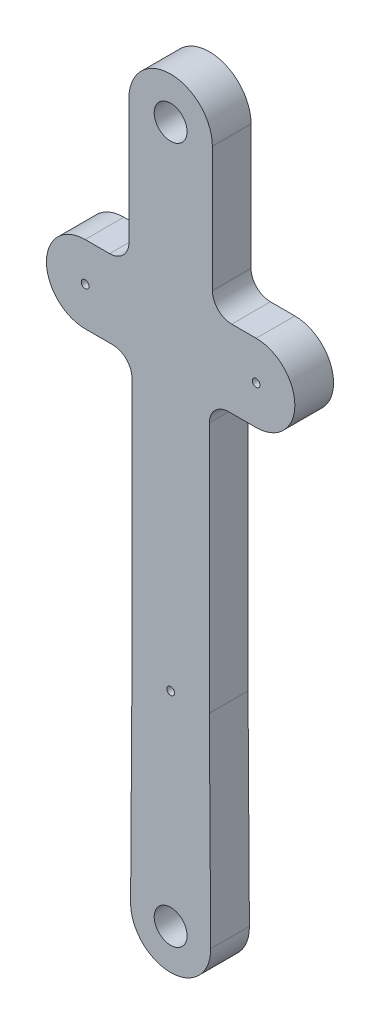
ISO-10303-21;
HEADER;
FILE_DESCRIPTION(('STEP AP214'),'2;1');
FILE_NAME('part.step','',(''),(''),'','','');
FILE_SCHEMA(('AUTOMOTIVE_DESIGN { 1 0 10303 214 1 1 1 1 }'));
ENDSEC;
DATA;
#1=APPLICATION_CONTEXT('core data for automotive mechanical design processes');
#2=APPLICATION_PROTOCOL_DEFINITION('international standard','automotive_design',2000,#1);
#3=PRODUCT_CONTEXT('',#1,'mechanical');
#4=PRODUCT('Part','Part','',(#3));
#5=PRODUCT_RELATED_PRODUCT_CATEGORY('part','',(#4));
#6=PRODUCT_DEFINITION_FORMATION('','',#4);
#7=PRODUCT_DEFINITION_CONTEXT('part definition',#1,'design');
#8=PRODUCT_DEFINITION('design','',#6,#7);
#9=PRODUCT_DEFINITION_SHAPE('','',#8);
#10=(LENGTH_UNIT() NAMED_UNIT(*) SI_UNIT(.MILLI.,.METRE.));
#11=(NAMED_UNIT(*) PLANE_ANGLE_UNIT() SI_UNIT($,.RADIAN.));
#12=(NAMED_UNIT(*) SI_UNIT($,.STERADIAN.) SOLID_ANGLE_UNIT());
#13=UNCERTAINTY_MEASURE_WITH_UNIT(LENGTH_MEASURE(1.E-05),#10,'distance_accuracy_value','');
#14=(GEOMETRIC_REPRESENTATION_CONTEXT(3) GLOBAL_UNCERTAINTY_ASSIGNED_CONTEXT((#13)) GLOBAL_UNIT_ASSIGNED_CONTEXT((#10,
#11,#12)) REPRESENTATION_CONTEXT('',''));
#15=CARTESIAN_POINT('',(0.,0.,0.));
#16=DIRECTION('',(0.,0.,1.));
#17=DIRECTION('',(1.,0.,0.));
#18=AXIS2_PLACEMENT_3D('',#15,#16,#17);
#19=CARTESIAN_POINT('',(-22.1,0.,10.));
#20=DIRECTION('',(0.,0.,1.));
#21=DIRECTION('',(1.,0.,0.));
#22=AXIS2_PLACEMENT_3D('',#19,#20,#21);
#23=PLANE('',#22);
#24=CARTESIAN_POINT('',(0.,47.3122607378935,10.));
#25=DIRECTION('',(0.,0.,1.));
#26=DIRECTION('',(1.,0.,0.));
#27=AXIS2_PLACEMENT_3D('',#24,#25,#26);
#28=CIRCLE('',#27,4.25);
#29=CARTESIAN_POINT('',(4.25,47.3122607378935,10.));
#30=VERTEX_POINT('',#29);
#31=EDGE_CURVE('E340',#30,#30,#28,.T.);
#32=ORIENTED_EDGE('',*,*,#31,.F.);
#33=EDGE_LOOP('',(#32));
#34=FACE_BOUND('',#33,.T.);
#35=CARTESIAN_POINT('',(22.1,0.,10.));
#36=DIRECTION('',(0.,0.,1.));
#37=DIRECTION('',(1.,0.,0.));
#38=AXIS2_PLACEMENT_3D('',#35,#36,#37);
#39=CIRCLE('',#38,1.);
#40=CARTESIAN_POINT('',(23.1,0.,10.));
#41=VERTEX_POINT('',#40);
#42=EDGE_CURVE('E328',#41,#41,#39,.T.);
#43=ORIENTED_EDGE('',*,*,#42,.F.);
#44=EDGE_LOOP('',(#43));
#45=FACE_BOUND('',#44,.T.);
#46=CARTESIAN_POINT('',(-22.1,0.,10.));
#47=DIRECTION('',(0.,0.,1.));
#48=DIRECTION('',(1.,0.,0.));
#49=AXIS2_PLACEMENT_3D('',#46,#47,#48);
#50=CIRCLE('',#49,10.);
#51=CARTESIAN_POINT('',(-22.1,10.,10.));
#52=VERTEX_POINT('',#51);
#53=CARTESIAN_POINT('',(-22.1,-10.,10.));
#54=VERTEX_POINT('',#53);
#55=EDGE_CURVE('E170',#52,#54,#50,.T.);
#56=ORIENTED_EDGE('',*,*,#55,.T.);
#57=DIRECTION('',(1.,0.,0.));
#58=VECTOR('',#57,1.);
#59=CARTESIAN_POINT('',(-22.1,-10.,10.));
#60=LINE('',#59,#58);
#61=CARTESIAN_POINT('',(-15.,-10.,10.));
#62=VERTEX_POINT('',#61);
#63=EDGE_CURVE('E158',#54,#62,#60,.T.);
#64=ORIENTED_EDGE('',*,*,#63,.T.);
#65=CARTESIAN_POINT('',(-15.,-15.,10.));
#66=DIRECTION('',(0.,0.,1.));
#67=DIRECTION('',(1.,0.,0.));
#68=AXIS2_PLACEMENT_3D('',#65,#66,#67);
#69=CIRCLE('',#68,5.);
#70=CARTESIAN_POINT('',(-9.99999999999999,-15.,10.));
#71=VERTEX_POINT('',#70);
#72=EDGE_CURVE('E215',#62,#71,#69,.F.);
#73=ORIENTED_EDGE('',*,*,#72,.T.);
#74=DIRECTION('',(0.,-1.,0.));
#75=VECTOR('',#74,1.);
#76=CARTESIAN_POINT('',(-9.99999999999999,-80.,10.));
#77=LINE('',#76,#75);
#78=CARTESIAN_POINT('',(-9.99999999999999,-80.,10.));
#79=VERTEX_POINT('',#78);
#80=EDGE_CURVE('E169',#71,#79,#77,.T.);
#81=ORIENTED_EDGE('',*,*,#80,.T.);
#82=DIRECTION('',(-0.00671697923275562,-0.999977440840535,0.));
#83=VECTOR('',#82,1.);
#84=CARTESIAN_POINT('',(-10.3528567364597,-132.530872000857,10.));
#85=LINE('',#84,#83);
#86=CARTESIAN_POINT('',(-10.3528567364597,-132.530872000857,10.));
#87=VERTEX_POINT('',#86);
#88=EDGE_CURVE('E322',#79,#87,#85,.T.);
#89=ORIENTED_EDGE('',*,*,#88,.T.);
#90=CARTESIAN_POINT('',(0.,-132.687739262107,10.));
#91=DIRECTION('',(0.,0.,1.));
#92=DIRECTION('',(1.,0.,0.));
#93=AXIS2_PLACEMENT_3D('',#90,#91,#92);
#94=CIRCLE('',#93,10.3540451005059);
#95=CARTESIAN_POINT('',(10.3528567364597,-132.530872000857,10.));
#96=VERTEX_POINT('',#95);
#97=EDGE_CURVE('E293',#87,#96,#94,.T.);
#98=ORIENTED_EDGE('',*,*,#97,.T.);
#99=DIRECTION('',(-0.00671697923275601,0.999977440840535,0.));
#100=VECTOR('',#99,1.);
#101=CARTESIAN_POINT('',(10.3528567364597,-132.530872000857,10.));
#102=LINE('',#101,#100);
#103=CARTESIAN_POINT('',(9.99999999999999,-80.,10.));
#104=VERTEX_POINT('',#103);
#105=EDGE_CURVE('E319',#96,#104,#102,.T.);
#106=ORIENTED_EDGE('',*,*,#105,.T.);
#107=DIRECTION('',(0.,1.,0.));
#108=VECTOR('',#107,1.);
#109=CARTESIAN_POINT('',(9.99999999999999,-80.,10.));
#110=LINE('',#109,#108);
#111=CARTESIAN_POINT('',(9.99999999999999,-15.,10.));
#112=VERTEX_POINT('',#111);
#113=EDGE_CURVE('E226',#104,#112,#110,.T.);
#114=ORIENTED_EDGE('',*,*,#113,.T.);
#115=CARTESIAN_POINT('',(15.,-15.,10.));
#116=DIRECTION('',(0.,0.,1.));
#117=DIRECTION('',(1.,0.,0.));
#118=AXIS2_PLACEMENT_3D('',#115,#116,#117);
#119=CIRCLE('',#118,5.);
#120=CARTESIAN_POINT('',(15.,-10.,10.));
#121=VERTEX_POINT('',#120);
#122=EDGE_CURVE('E219',#112,#121,#119,.F.);
#123=ORIENTED_EDGE('',*,*,#122,.T.);
#124=DIRECTION('',(1.,0.,0.));
#125=VECTOR('',#124,1.);
#126=CARTESIAN_POINT('',(9.99999999999999,-10.,10.));
#127=LINE('',#126,#125);
#128=CARTESIAN_POINT('',(22.1,-10.,10.));
#129=VERTEX_POINT('',#128);
#130=EDGE_CURVE('E223',#121,#129,#127,.T.);
#131=ORIENTED_EDGE('',*,*,#130,.T.);
#132=CARTESIAN_POINT('',(22.1,0.,10.));
#133=DIRECTION('',(0.,0.,1.));
#134=DIRECTION('',(1.,0.,0.));
#135=AXIS2_PLACEMENT_3D('',#132,#133,#134);
#136=CIRCLE('',#135,10.);
#137=CARTESIAN_POINT('',(22.1,10.,10.));
#138=VERTEX_POINT('',#137);
#139=EDGE_CURVE('E236',#129,#138,#136,.T.);
#140=ORIENTED_EDGE('',*,*,#139,.T.);
#141=DIRECTION('',(-1.,0.,0.));
#142=VECTOR('',#141,1.);
#143=CARTESIAN_POINT('',(10.7828841411512,10.,10.));
#144=LINE('',#143,#142);
#145=CARTESIAN_POINT('',(15.7828841411512,10.,10.));
#146=VERTEX_POINT('',#145);
#147=EDGE_CURVE('E315',#138,#146,#144,.T.);
#148=ORIENTED_EDGE('',*,*,#147,.T.);
#149=CARTESIAN_POINT('',(15.7828841411512,15.,10.));
#150=DIRECTION('',(0.,0.,1.));
#151=DIRECTION('',(1.,0.,0.));
#152=AXIS2_PLACEMENT_3D('',#149,#150,#151);
#153=CIRCLE('',#152,5.);
#154=CARTESIAN_POINT('',(10.7828841411512,15.,10.));
#155=VERTEX_POINT('',#154);
#156=EDGE_CURVE('E11',#146,#155,#153,.F.);
#157=ORIENTED_EDGE('',*,*,#156,.T.);
#158=DIRECTION('',(0.,1.,0.));
#159=VECTOR('',#158,1.);
#160=CARTESIAN_POINT('',(10.7828841411512,47.3122607378935,10.));
#161=LINE('',#160,#159);
#162=CARTESIAN_POINT('',(10.7828841411512,47.3122607378935,10.));
#163=VERTEX_POINT('',#162);
#164=EDGE_CURVE('E313',#155,#163,#161,.T.);
#165=ORIENTED_EDGE('',*,*,#164,.T.);
#166=CARTESIAN_POINT('',(0.,47.3122607378935,10.));
#167=DIRECTION('',(0.,0.,1.));
#168=DIRECTION('',(1.,0.,0.));
#169=AXIS2_PLACEMENT_3D('',#166,#167,#168);
#170=CIRCLE('',#169,10.7828841411512);
#171=CARTESIAN_POINT('',(-10.7828841411512,47.3122607378935,10.));
#172=VERTEX_POINT('',#171);
#173=EDGE_CURVE('E311',#163,#172,#170,.T.);
#174=ORIENTED_EDGE('',*,*,#173,.T.);
#175=DIRECTION('',(0.,-1.,0.));
#176=VECTOR('',#175,1.);
#177=CARTESIAN_POINT('',(-10.7828841411512,47.3122607378935,10.));
#178=LINE('',#177,#176);
#179=CARTESIAN_POINT('',(-10.7828841411512,15.,10.));
#180=VERTEX_POINT('',#179);
#181=EDGE_CURVE('E308',#172,#180,#178,.T.);
#182=ORIENTED_EDGE('',*,*,#181,.T.);
#183=CARTESIAN_POINT('',(-15.7828841411512,15.,10.));
#184=DIRECTION('',(0.,0.,1.));
#185=DIRECTION('',(1.,0.,0.));
#186=AXIS2_PLACEMENT_3D('',#183,#184,#185);
#187=CIRCLE('',#186,5.);
#188=CARTESIAN_POINT('',(-15.7828841411512,10.,10.));
#189=VERTEX_POINT('',#188);
#190=EDGE_CURVE('E211',#180,#189,#187,.F.);
#191=ORIENTED_EDGE('',*,*,#190,.T.);
#192=DIRECTION('',(-1.,0.,0.));
#193=VECTOR('',#192,1.);
#194=CARTESIAN_POINT('',(-22.1,10.,10.));
#195=LINE('',#194,#193);
#196=EDGE_CURVE('E175',#189,#52,#195,.T.);
#197=ORIENTED_EDGE('',*,*,#196,.T.);
#198=EDGE_LOOP('',(#56,#64,#73,#81,#89,#98,#106,#114,#123,#131,#140,#148,#157,#165,#174,#182,
#191,#197));
#199=FACE_BOUND('',#198,.T.);
#200=CARTESIAN_POINT('',(-22.1,0.,10.));
#201=DIRECTION('',(0.,0.,1.));
#202=DIRECTION('',(1.,0.,0.));
#203=AXIS2_PLACEMENT_3D('',#200,#201,#202);
#204=CIRCLE('',#203,1.);
#205=CARTESIAN_POINT('',(-21.1,0.,10.));
#206=VERTEX_POINT('',#205);
#207=EDGE_CURVE('E306',#206,#206,#204,.T.);
#208=ORIENTED_EDGE('',*,*,#207,.F.);
#209=EDGE_LOOP('',(#208));
#210=FACE_BOUND('',#209,.T.);
#211=CARTESIAN_POINT('',(0.,-80.,10.));
#212=DIRECTION('',(0.,0.,1.));
#213=DIRECTION('',(1.,0.,0.));
#214=AXIS2_PLACEMENT_3D('',#211,#212,#213);
#215=CIRCLE('',#214,1.);
#216=CARTESIAN_POINT('',(1.00000000000001,-80.,10.));
#217=VERTEX_POINT('',#216);
#218=EDGE_CURVE('E334',#217,#217,#215,.T.);
#219=ORIENTED_EDGE('',*,*,#218,.F.);
#220=EDGE_LOOP('',(#219));
#221=FACE_BOUND('',#220,.T.);
#222=CARTESIAN_POINT('',(0.,-132.687739262107,10.));
#223=DIRECTION('',(0.,0.,1.));
#224=DIRECTION('',(1.,0.,0.));
#225=AXIS2_PLACEMENT_3D('',#222,#223,#224);
#226=CIRCLE('',#225,4.25);
#227=CARTESIAN_POINT('',(4.25000000000001,-132.687739262107,10.));
#228=VERTEX_POINT('',#227);
#229=EDGE_CURVE('E346',#228,#228,#226,.T.);
#230=ORIENTED_EDGE('',*,*,#229,.F.);
#231=EDGE_LOOP('',(#230));
#232=FACE_BOUND('',#231,.T.);
#233=ADVANCED_FACE('F33',(#34,#45,#199,#210,#221,#232),#23,.T.);
#234=CARTESIAN_POINT('',(-22.1,0.,0.));
#235=DIRECTION('',(0.,0.,1.));
#236=DIRECTION('',(1.,0.,0.));
#237=AXIS2_PLACEMENT_3D('',#234,#235,#236);
#238=PLANE('',#237);
#239=CARTESIAN_POINT('',(-22.1,0.,0.));
#240=DIRECTION('',(0.,0.,1.));
#241=DIRECTION('',(1.,0.,0.));
#242=AXIS2_PLACEMENT_3D('',#239,#240,#241);
#243=CIRCLE('',#242,10.);
#244=CARTESIAN_POINT('',(-22.1,10.,0.));
#245=VERTEX_POINT('',#244);
#246=CARTESIAN_POINT('',(-22.1,-10.,0.));
#247=VERTEX_POINT('',#246);
#248=EDGE_CURVE('E183',#245,#247,#243,.T.);
#249=ORIENTED_EDGE('',*,*,#248,.F.);
#250=DIRECTION('',(-1.,0.,0.));
#251=VECTOR('',#250,1.);
#252=CARTESIAN_POINT('',(-22.1,10.,0.));
#253=LINE('',#252,#251);
#254=CARTESIAN_POINT('',(-15.7828841411512,10.,0.));
#255=VERTEX_POINT('',#254);
#256=EDGE_CURVE('E179',#255,#245,#253,.T.);
#257=ORIENTED_EDGE('',*,*,#256,.F.);
#258=CARTESIAN_POINT('',(-15.7828841411512,15.,0.));
#259=DIRECTION('',(0.,0.,1.));
#260=DIRECTION('',(1.,0.,0.));
#261=AXIS2_PLACEMENT_3D('',#258,#259,#260);
#262=CIRCLE('',#261,5.);
#263=CARTESIAN_POINT('',(-10.7828841411512,15.,0.));
#264=VERTEX_POINT('',#263);
#265=EDGE_CURVE('E209',#255,#264,#262,.T.);
#266=ORIENTED_EDGE('',*,*,#265,.T.);
#267=DIRECTION('',(0.,-1.,0.));
#268=VECTOR('',#267,1.);
#269=CARTESIAN_POINT('',(-10.7828841411512,47.3122607378935,0.));
#270=LINE('',#269,#268);
#271=CARTESIAN_POINT('',(-10.7828841411512,47.3122607378935,0.));
#272=VERTEX_POINT('',#271);
#273=EDGE_CURVE('E267',#272,#264,#270,.T.);
#274=ORIENTED_EDGE('',*,*,#273,.F.);
#275=CARTESIAN_POINT('',(0.,47.3122607378935,0.));
#276=DIRECTION('',(0.,0.,1.));
#277=DIRECTION('',(1.,0.,0.));
#278=AXIS2_PLACEMENT_3D('',#275,#276,#277);
#279=CIRCLE('',#278,10.7828841411512);
#280=CARTESIAN_POINT('',(10.7828841411512,47.3122607378935,0.));
#281=VERTEX_POINT('',#280);
#282=EDGE_CURVE('E265',#281,#272,#279,.T.);
#283=ORIENTED_EDGE('',*,*,#282,.F.);
#284=DIRECTION('',(0.,1.,0.));
#285=VECTOR('',#284,1.);
#286=CARTESIAN_POINT('',(10.7828841411512,47.3122607378935,0.));
#287=LINE('',#286,#285);
#288=CARTESIAN_POINT('',(10.7828841411512,15.,0.));
#289=VERTEX_POINT('',#288);
#290=EDGE_CURVE('E263',#289,#281,#287,.T.);
#291=ORIENTED_EDGE('',*,*,#290,.F.);
#292=CARTESIAN_POINT('',(15.7828841411512,15.,0.));
#293=DIRECTION('',(0.,0.,1.));
#294=DIRECTION('',(1.,0.,0.));
#295=AXIS2_PLACEMENT_3D('',#292,#293,#294);
#296=CIRCLE('',#295,5.);
#297=CARTESIAN_POINT('',(15.7828841411512,10.,0.));
#298=VERTEX_POINT('',#297);
#299=EDGE_CURVE('E41',#289,#298,#296,.T.);
#300=ORIENTED_EDGE('',*,*,#299,.T.);
#301=DIRECTION('',(-1.,0.,0.));
#302=VECTOR('',#301,1.);
#303=CARTESIAN_POINT('',(10.7828841411512,10.,0.));
#304=LINE('',#303,#302);
#305=CARTESIAN_POINT('',(22.1,10.,0.));
#306=VERTEX_POINT('',#305);
#307=EDGE_CURVE('E261',#306,#298,#304,.T.);
#308=ORIENTED_EDGE('',*,*,#307,.F.);
#309=CARTESIAN_POINT('',(22.1,0.,0.));
#310=DIRECTION('',(0.,0.,1.));
#311=DIRECTION('',(1.,0.,0.));
#312=AXIS2_PLACEMENT_3D('',#309,#310,#311);
#313=CIRCLE('',#312,10.);
#314=CARTESIAN_POINT('',(22.1,-10.,0.));
#315=VERTEX_POINT('',#314);
#316=EDGE_CURVE('E254',#315,#306,#313,.T.);
#317=ORIENTED_EDGE('',*,*,#316,.F.);
#318=DIRECTION('',(1.,0.,0.));
#319=VECTOR('',#318,1.);
#320=CARTESIAN_POINT('',(9.99999999999999,-10.,0.));
#321=LINE('',#320,#319);
#322=CARTESIAN_POINT('',(15.,-10.,0.));
#323=VERTEX_POINT('',#322);
#324=EDGE_CURVE('E246',#323,#315,#321,.T.);
#325=ORIENTED_EDGE('',*,*,#324,.F.);
#326=CARTESIAN_POINT('',(15.,-15.,0.));
#327=DIRECTION('',(0.,0.,1.));
#328=DIRECTION('',(1.,0.,0.));
#329=AXIS2_PLACEMENT_3D('',#326,#327,#328);
#330=CIRCLE('',#329,5.);
#331=CARTESIAN_POINT('',(9.99999999999999,-15.,0.));
#332=VERTEX_POINT('',#331);
#333=EDGE_CURVE('E217',#323,#332,#330,.T.);
#334=ORIENTED_EDGE('',*,*,#333,.T.);
#335=DIRECTION('',(0.,1.,0.));
#336=VECTOR('',#335,1.);
#337=CARTESIAN_POINT('',(9.99999999999999,-80.,0.));
#338=LINE('',#337,#336);
#339=CARTESIAN_POINT('',(9.99999999999999,-80.,0.));
#340=VERTEX_POINT('',#339);
#341=EDGE_CURVE('E244',#340,#332,#338,.T.);
#342=ORIENTED_EDGE('',*,*,#341,.F.);
#343=DIRECTION('',(-0.00671697923275601,0.999977440840535,0.));
#344=VECTOR('',#343,1.);
#345=CARTESIAN_POINT('',(10.3528567364597,-132.530872000857,0.));
#346=LINE('',#345,#344);
#347=CARTESIAN_POINT('',(10.3528567364597,-132.530872000857,0.));
#348=VERTEX_POINT('',#347);
#349=EDGE_CURVE('E252',#348,#340,#346,.T.);
#350=ORIENTED_EDGE('',*,*,#349,.F.);
#351=CARTESIAN_POINT('',(0.,-132.687739262107,0.));
#352=DIRECTION('',(0.,0.,1.));
#353=DIRECTION('',(1.,0.,0.));
#354=AXIS2_PLACEMENT_3D('',#351,#352,#353);
#355=CIRCLE('',#354,10.3540451005059);
#356=CARTESIAN_POINT('',(-10.3528567364597,-132.530872000857,0.));
#357=VERTEX_POINT('',#356);
#358=EDGE_CURVE('E256',#357,#348,#355,.T.);
#359=ORIENTED_EDGE('',*,*,#358,.F.);
#360=DIRECTION('',(-0.00671697923275562,-0.999977440840535,0.));
#361=VECTOR('',#360,1.);
#362=CARTESIAN_POINT('',(-10.3528567364597,-132.530872000857,0.));
#363=LINE('',#362,#361);
#364=CARTESIAN_POINT('',(-9.99999999999999,-80.,0.));
#365=VERTEX_POINT('',#364);
#366=EDGE_CURVE('E298',#365,#357,#363,.T.);
#367=ORIENTED_EDGE('',*,*,#366,.F.);
#368=DIRECTION('',(0.,-1.,0.));
#369=VECTOR('',#368,1.);
#370=CARTESIAN_POINT('',(-9.99999999999999,-80.,0.));
#371=LINE('',#370,#369);
#372=CARTESIAN_POINT('',(-9.99999999999999,-15.,0.));
#373=VERTEX_POINT('',#372);
#374=EDGE_CURVE('E299',#373,#365,#371,.T.);
#375=ORIENTED_EDGE('',*,*,#374,.F.);
#376=CARTESIAN_POINT('',(-15.,-15.,0.));
#377=DIRECTION('',(0.,0.,1.));
#378=DIRECTION('',(1.,0.,0.));
#379=AXIS2_PLACEMENT_3D('',#376,#377,#378);
#380=CIRCLE('',#379,5.);
#381=CARTESIAN_POINT('',(-15.,-10.,0.));
#382=VERTEX_POINT('',#381);
#383=EDGE_CURVE('E213',#373,#382,#380,.T.);
#384=ORIENTED_EDGE('',*,*,#383,.T.);
#385=DIRECTION('',(1.,0.,0.));
#386=VECTOR('',#385,1.);
#387=CARTESIAN_POINT('',(-22.1,-10.,0.));
#388=LINE('',#387,#386);
#389=EDGE_CURVE('E303',#247,#382,#388,.T.);
#390=ORIENTED_EDGE('',*,*,#389,.F.);
#391=EDGE_LOOP('',(#249,#257,#266,#274,#283,#291,#300,#308,#317,#325,#334,#342,#350,#359,#367,
#375,#384,#390));
#392=FACE_BOUND('',#391,.T.);
#393=CARTESIAN_POINT('',(-22.1,0.,0.));
#394=DIRECTION('',(0.,0.,1.));
#395=DIRECTION('',(1.,0.,0.));
#396=AXIS2_PLACEMENT_3D('',#393,#394,#395);
#397=CIRCLE('',#396,1.);
#398=CARTESIAN_POINT('',(-21.1,0.,0.));
#399=VERTEX_POINT('',#398);
#400=EDGE_CURVE('E325',#399,#399,#397,.T.);
#401=ORIENTED_EDGE('',*,*,#400,.T.);
#402=EDGE_LOOP('',(#401));
#403=FACE_BOUND('',#402,.T.);
#404=CARTESIAN_POINT('',(22.1,0.,0.));
#405=DIRECTION('',(0.,0.,1.));
#406=DIRECTION('',(1.,0.,0.));
#407=AXIS2_PLACEMENT_3D('',#404,#405,#406);
#408=CIRCLE('',#407,1.);
#409=CARTESIAN_POINT('',(23.1,0.,0.));
#410=VERTEX_POINT('',#409);
#411=EDGE_CURVE('E331',#410,#410,#408,.T.);
#412=ORIENTED_EDGE('',*,*,#411,.T.);
#413=EDGE_LOOP('',(#412));
#414=FACE_BOUND('',#413,.T.);
#415=CARTESIAN_POINT('',(0.,-80.,0.));
#416=DIRECTION('',(0.,0.,1.));
#417=DIRECTION('',(1.,0.,0.));
#418=AXIS2_PLACEMENT_3D('',#415,#416,#417);
#419=CIRCLE('',#418,1.);
#420=CARTESIAN_POINT('',(1.00000000000001,-80.,0.));
#421=VERTEX_POINT('',#420);
#422=EDGE_CURVE('E337',#421,#421,#419,.T.);
#423=ORIENTED_EDGE('',*,*,#422,.T.);
#424=EDGE_LOOP('',(#423));
#425=FACE_BOUND('',#424,.T.);
#426=CARTESIAN_POINT('',(0.,47.3122607378935,0.));
#427=DIRECTION('',(0.,0.,1.));
#428=DIRECTION('',(1.,0.,0.));
#429=AXIS2_PLACEMENT_3D('',#426,#427,#428);
#430=CIRCLE('',#429,4.25);
#431=CARTESIAN_POINT('',(4.25,47.3122607378935,0.));
#432=VERTEX_POINT('',#431);
#433=EDGE_CURVE('E343',#432,#432,#430,.T.);
#434=ORIENTED_EDGE('',*,*,#433,.T.);
#435=EDGE_LOOP('',(#434));
#436=FACE_BOUND('',#435,.T.);
#437=CARTESIAN_POINT('',(0.,-132.687739262107,0.));
#438=DIRECTION('',(0.,0.,1.));
#439=DIRECTION('',(1.,0.,0.));
#440=AXIS2_PLACEMENT_3D('',#437,#438,#439);
#441=CIRCLE('',#440,4.25);
#442=CARTESIAN_POINT('',(4.25000000000001,-132.687739262107,0.));
#443=VERTEX_POINT('',#442);
#444=EDGE_CURVE('E349',#443,#443,#441,.T.);
#445=ORIENTED_EDGE('',*,*,#444,.T.);
#446=EDGE_LOOP('',(#445));
#447=FACE_BOUND('',#446,.T.);
#448=ADVANCED_FACE('F241',(#392,#403,#414,#425,#436,#447),#238,.F.);
#449=CARTESIAN_POINT('',(-22.1,0.,10.));
#450=DIRECTION('',(0.,0.,-1.));
#451=DIRECTION('',(-1.,0.,0.));
#452=AXIS2_PLACEMENT_3D('',#449,#450,#451);
#453=CYLINDRICAL_SURFACE('',#452,10.);
#454=ORIENTED_EDGE('',*,*,#248,.T.);
#455=DIRECTION('',(0.,0.,-1.));
#456=VECTOR('',#455,1.);
#457=CARTESIAN_POINT('',(-22.1,-10.,10.));
#458=LINE('',#457,#456);
#459=EDGE_CURVE('E163',#54,#247,#458,.T.);
#460=ORIENTED_EDGE('',*,*,#459,.F.);
#461=ORIENTED_EDGE('',*,*,#55,.F.);
#462=DIRECTION('',(0.,0.,-1.));
#463=VECTOR('',#462,1.);
#464=CARTESIAN_POINT('',(-22.1,10.,10.));
#465=LINE('',#464,#463);
#466=EDGE_CURVE('E271',#52,#245,#465,.T.);
#467=ORIENTED_EDGE('',*,*,#466,.T.);
#468=EDGE_LOOP('',(#454,#460,#461,#467));
#469=FACE_BOUND('',#468,.T.);
#470=ADVANCED_FACE('F181',(#469),#453,.T.);
#471=CARTESIAN_POINT('',(-22.1,-10.,10.));
#472=DIRECTION('',(0.,1.,0.));
#473=DIRECTION('',(0.,0.,1.));
#474=AXIS2_PLACEMENT_3D('',#471,#472,#473);
#475=PLANE('',#474);
#476=ORIENTED_EDGE('',*,*,#389,.T.);
#477=DIRECTION('',(0.,0.,-1.));
#478=VECTOR('',#477,1.);
#479=CARTESIAN_POINT('',(-15.,-10.,10.));
#480=LINE('',#479,#478);
#481=EDGE_CURVE('E166',#382,#62,#480,.F.);
#482=ORIENTED_EDGE('',*,*,#481,.T.);
#483=ORIENTED_EDGE('',*,*,#63,.F.);
#484=ORIENTED_EDGE('',*,*,#459,.T.);
#485=EDGE_LOOP('',(#476,#482,#483,#484));
#486=FACE_BOUND('',#485,.T.);
#487=ADVANCED_FACE('F161',(#486),#475,.F.);
#488=CARTESIAN_POINT('',(-9.99999999999999,-80.,10.));
#489=DIRECTION('',(1.,0.,0.));
#490=DIRECTION('',(0.,0.,-1.));
#491=AXIS2_PLACEMENT_3D('',#488,#489,#490);
#492=PLANE('',#491);
#493=ORIENTED_EDGE('',*,*,#80,.F.);
#494=DIRECTION('',(0.,0.,-1.));
#495=VECTOR('',#494,1.);
#496=CARTESIAN_POINT('',(-9.99999999999999,-15.,0.));
#497=LINE('',#496,#495);
#498=EDGE_CURVE('E196',#71,#373,#497,.T.);
#499=ORIENTED_EDGE('',*,*,#498,.T.);
#500=ORIENTED_EDGE('',*,*,#374,.T.);
#501=DIRECTION('',(0.,0.,-1.));
#502=VECTOR('',#501,1.);
#503=CARTESIAN_POINT('',(-9.99999999999999,-80.,10.));
#504=LINE('',#503,#502);
#505=EDGE_CURVE('E185',#79,#365,#504,.T.);
#506=ORIENTED_EDGE('',*,*,#505,.F.);
#507=EDGE_LOOP('',(#493,#499,#500,#506));
#508=FACE_BOUND('',#507,.T.);
#509=ADVANCED_FACE('F407',(#508),#492,.F.);
#510=CARTESIAN_POINT('',(-10.3528567364597,-132.530872000857,10.));
#511=DIRECTION('',(0.999977440840536,-0.00671697923275562,0.));
#512=DIRECTION('',(0.00671697923275562,0.999977440840536,0.));
#513=AXIS2_PLACEMENT_3D('',#510,#511,#512);
#514=PLANE('',#513);
#515=ORIENTED_EDGE('',*,*,#366,.T.);
#516=DIRECTION('',(0.,0.,-1.));
#517=VECTOR('',#516,1.);
#518=CARTESIAN_POINT('',(-10.3528567364597,-132.530872000857,10.));
#519=LINE('',#518,#517);
#520=EDGE_CURVE('E191',#87,#357,#519,.T.);
#521=ORIENTED_EDGE('',*,*,#520,.F.);
#522=ORIENTED_EDGE('',*,*,#88,.F.);
#523=ORIENTED_EDGE('',*,*,#505,.T.);
#524=EDGE_LOOP('',(#515,#521,#522,#523));
#525=FACE_BOUND('',#524,.T.);
#526=ADVANCED_FACE('F404',(#525),#514,.F.);
#527=CARTESIAN_POINT('',(0.,-132.687739262107,10.));
#528=DIRECTION('',(0.,0.,-1.));
#529=DIRECTION('',(-1.,0.,0.));
#530=AXIS2_PLACEMENT_3D('',#527,#528,#529);
#531=CYLINDRICAL_SURFACE('',#530,10.3540451005059);
#532=ORIENTED_EDGE('',*,*,#358,.T.);
#533=DIRECTION('',(0.,0.,-1.));
#534=VECTOR('',#533,1.);
#535=CARTESIAN_POINT('',(10.3528567364597,-132.530872000857,10.));
#536=LINE('',#535,#534);
#537=EDGE_CURVE('E284',#96,#348,#536,.T.);
#538=ORIENTED_EDGE('',*,*,#537,.F.);
#539=ORIENTED_EDGE('',*,*,#97,.F.);
#540=ORIENTED_EDGE('',*,*,#520,.T.);
#541=EDGE_LOOP('',(#532,#538,#539,#540));
#542=FACE_BOUND('',#541,.T.);
#543=ADVANCED_FACE('F291',(#542),#531,.T.);
#544=CARTESIAN_POINT('',(10.3528567364597,-132.530872000857,10.));
#545=DIRECTION('',(-0.999977440840536,-0.00671697923275601,0.));
#546=DIRECTION('',(0.00671697923275601,-0.999977440840536,0.));
#547=AXIS2_PLACEMENT_3D('',#544,#545,#546);
#548=PLANE('',#547);
#549=ORIENTED_EDGE('',*,*,#349,.T.);
#550=DIRECTION('',(0.,0.,-1.));
#551=VECTOR('',#550,1.);
#552=CARTESIAN_POINT('',(9.99999999999999,-80.,10.));
#553=LINE('',#552,#551);
#554=EDGE_CURVE('E251',#104,#340,#553,.T.);
#555=ORIENTED_EDGE('',*,*,#554,.F.);
#556=ORIENTED_EDGE('',*,*,#105,.F.);
#557=ORIENTED_EDGE('',*,*,#537,.T.);
#558=EDGE_LOOP('',(#549,#555,#556,#557));
#559=FACE_BOUND('',#558,.T.);
#560=ADVANCED_FACE('F398',(#559),#548,.F.);
#561=CARTESIAN_POINT('',(9.99999999999999,-80.,10.));
#562=DIRECTION('',(-1.,0.,0.));
#563=DIRECTION('',(0.,-1.,0.));
#564=AXIS2_PLACEMENT_3D('',#561,#562,#563);
#565=PLANE('',#564);
#566=ORIENTED_EDGE('',*,*,#341,.T.);
#567=DIRECTION('',(0.,0.,-1.));
#568=VECTOR('',#567,1.);
#569=CARTESIAN_POINT('',(9.99999999999999,-15.,10.));
#570=LINE('',#569,#568);
#571=EDGE_CURVE('E203',#332,#112,#570,.F.);
#572=ORIENTED_EDGE('',*,*,#571,.T.);
#573=ORIENTED_EDGE('',*,*,#113,.F.);
#574=ORIENTED_EDGE('',*,*,#554,.T.);
#575=EDGE_LOOP('',(#566,#572,#573,#574));
#576=FACE_BOUND('',#575,.T.);
#577=ADVANCED_FACE('F249',(#576),#565,.F.);
#578=CARTESIAN_POINT('',(9.99999999999999,-10.,10.));
#579=DIRECTION('',(0.,1.,0.));
#580=DIRECTION('',(0.,0.,1.));
#581=AXIS2_PLACEMENT_3D('',#578,#579,#580);
#582=PLANE('',#581);
#583=ORIENTED_EDGE('',*,*,#130,.F.);
#584=DIRECTION('',(0.,0.,-1.));
#585=VECTOR('',#584,1.);
#586=CARTESIAN_POINT('',(15.,-10.,0.));
#587=LINE('',#586,#585);
#588=EDGE_CURVE('E200',#121,#323,#587,.T.);
#589=ORIENTED_EDGE('',*,*,#588,.T.);
#590=ORIENTED_EDGE('',*,*,#324,.T.);
#591=DIRECTION('',(0.,0.,-1.));
#592=VECTOR('',#591,1.);
#593=CARTESIAN_POINT('',(22.1,-10.,10.));
#594=LINE('',#593,#592);
#595=EDGE_CURVE('E234',#129,#315,#594,.T.);
#596=ORIENTED_EDGE('',*,*,#595,.F.);
#597=EDGE_LOOP('',(#583,#589,#590,#596));
#598=FACE_BOUND('',#597,.T.);
#599=ADVANCED_FACE('F231',(#598),#582,.F.);
#600=CARTESIAN_POINT('',(22.1,0.,10.));
#601=DIRECTION('',(0.,0.,-1.));
#602=DIRECTION('',(-1.,0.,0.));
#603=AXIS2_PLACEMENT_3D('',#600,#601,#602);
#604=CYLINDRICAL_SURFACE('',#603,10.);
#605=ORIENTED_EDGE('',*,*,#316,.T.);
#606=DIRECTION('',(0.,0.,-1.));
#607=VECTOR('',#606,1.);
#608=CARTESIAN_POINT('',(22.1,10.,10.));
#609=LINE('',#608,#607);
#610=EDGE_CURVE('E279',#138,#306,#609,.T.);
#611=ORIENTED_EDGE('',*,*,#610,.F.);
#612=ORIENTED_EDGE('',*,*,#139,.F.);
#613=ORIENTED_EDGE('',*,*,#595,.T.);
#614=EDGE_LOOP('',(#605,#611,#612,#613));
#615=FACE_BOUND('',#614,.T.);
#616=ADVANCED_FACE('F390',(#615),#604,.T.);
#617=CARTESIAN_POINT('',(10.7828841411512,10.,10.));
#618=DIRECTION('',(0.,-1.,0.));
#619=DIRECTION('',(1.,0.,0.));
#620=AXIS2_PLACEMENT_3D('',#617,#618,#619);
#621=PLANE('',#620);
#622=ORIENTED_EDGE('',*,*,#307,.T.);
#623=DIRECTION('',(0.,0.,-1.));
#624=VECTOR('',#623,1.);
#625=CARTESIAN_POINT('',(15.7828841411512,10.,10.));
#626=LINE('',#625,#624);
#627=EDGE_CURVE('E48',#298,#146,#626,.F.);
#628=ORIENTED_EDGE('',*,*,#627,.T.);
#629=ORIENTED_EDGE('',*,*,#147,.F.);
#630=ORIENTED_EDGE('',*,*,#610,.T.);
#631=EDGE_LOOP('',(#622,#628,#629,#630));
#632=FACE_BOUND('',#631,.T.);
#633=ADVANCED_FACE('F386',(#632),#621,.F.);
#634=CARTESIAN_POINT('',(10.7828841411512,47.3122607378935,10.));
#635=DIRECTION('',(-1.,0.,0.));
#636=DIRECTION('',(0.,-1.,0.));
#637=AXIS2_PLACEMENT_3D('',#634,#635,#636);
#638=PLANE('',#637);
#639=ORIENTED_EDGE('',*,*,#164,.F.);
#640=DIRECTION('',(0.,0.,-1.));
#641=VECTOR('',#640,1.);
#642=CARTESIAN_POINT('',(10.7828841411512,15.,0.));
#643=LINE('',#642,#641);
#644=EDGE_CURVE('E205',#155,#289,#643,.T.);
#645=ORIENTED_EDGE('',*,*,#644,.T.);
#646=ORIENTED_EDGE('',*,*,#290,.T.);
#647=DIRECTION('',(0.,0.,-1.));
#648=VECTOR('',#647,1.);
#649=CARTESIAN_POINT('',(10.7828841411512,47.3122607378935,10.));
#650=LINE('',#649,#648);
#651=EDGE_CURVE('E276',#163,#281,#650,.T.);
#652=ORIENTED_EDGE('',*,*,#651,.F.);
#653=EDGE_LOOP('',(#639,#645,#646,#652));
#654=FACE_BOUND('',#653,.T.);
#655=ADVANCED_FACE('F382',(#654),#638,.F.);
#656=CARTESIAN_POINT('',(0.,47.3122607378935,10.));
#657=DIRECTION('',(0.,0.,-1.));
#658=DIRECTION('',(-1.,0.,0.));
#659=AXIS2_PLACEMENT_3D('',#656,#657,#658);
#660=CYLINDRICAL_SURFACE('',#659,10.7828841411512);
#661=ORIENTED_EDGE('',*,*,#282,.T.);
#662=DIRECTION('',(0.,0.,-1.));
#663=VECTOR('',#662,1.);
#664=CARTESIAN_POINT('',(-10.7828841411512,47.3122607378935,10.));
#665=LINE('',#664,#663);
#666=EDGE_CURVE('E273',#172,#272,#665,.T.);
#667=ORIENTED_EDGE('',*,*,#666,.F.);
#668=ORIENTED_EDGE('',*,*,#173,.F.);
#669=ORIENTED_EDGE('',*,*,#651,.T.);
#670=EDGE_LOOP('',(#661,#667,#668,#669));
#671=FACE_BOUND('',#670,.T.);
#672=ADVANCED_FACE('F378',(#671),#660,.T.);
#673=CARTESIAN_POINT('',(-10.7828841411512,47.3122607378935,10.));
#674=DIRECTION('',(1.,0.,0.));
#675=DIRECTION('',(0.,0.,-1.));
#676=AXIS2_PLACEMENT_3D('',#673,#674,#675);
#677=PLANE('',#676);
#678=ORIENTED_EDGE('',*,*,#273,.T.);
#679=DIRECTION('',(0.,0.,-1.));
#680=VECTOR('',#679,1.);
#681=CARTESIAN_POINT('',(-10.7828841411512,15.,10.));
#682=LINE('',#681,#680);
#683=EDGE_CURVE('E188',#264,#180,#682,.F.);
#684=ORIENTED_EDGE('',*,*,#683,.T.);
#685=ORIENTED_EDGE('',*,*,#181,.F.);
#686=ORIENTED_EDGE('',*,*,#666,.T.);
#687=EDGE_LOOP('',(#678,#684,#685,#686));
#688=FACE_BOUND('',#687,.T.);
#689=ADVANCED_FACE('F374',(#688),#677,.F.);
#690=CARTESIAN_POINT('',(-22.1,10.,10.));
#691=DIRECTION('',(0.,-1.,0.));
#692=DIRECTION('',(1.,0.,0.));
#693=AXIS2_PLACEMENT_3D('',#690,#691,#692);
#694=PLANE('',#693);
#695=ORIENTED_EDGE('',*,*,#196,.F.);
#696=DIRECTION('',(0.,0.,-1.));
#697=VECTOR('',#696,1.);
#698=CARTESIAN_POINT('',(-15.7828841411512,10.,0.));
#699=LINE('',#698,#697);
#700=EDGE_CURVE('E184',#189,#255,#699,.T.);
#701=ORIENTED_EDGE('',*,*,#700,.T.);
#702=ORIENTED_EDGE('',*,*,#256,.T.);
#703=ORIENTED_EDGE('',*,*,#466,.F.);
#704=EDGE_LOOP('',(#695,#701,#702,#703));
#705=FACE_BOUND('',#704,.T.);
#706=ADVANCED_FACE('F371',(#705),#694,.F.);
#707=CARTESIAN_POINT('',(-22.1,0.,10.));
#708=DIRECTION('',(0.,0.,-1.));
#709=DIRECTION('',(-1.,0.,0.));
#710=AXIS2_PLACEMENT_3D('',#707,#708,#709);
#711=CYLINDRICAL_SURFACE('',#710,1.);
#712=ORIENTED_EDGE('',*,*,#207,.T.);
#713=EDGE_LOOP('',(#712));
#714=FACE_BOUND('',#713,.T.);
#715=ORIENTED_EDGE('',*,*,#400,.F.);
#716=EDGE_LOOP('',(#715));
#717=FACE_BOUND('',#716,.T.);
#718=ADVANCED_FACE('F368',(#714,#717),#711,.F.);
#719=CARTESIAN_POINT('',(22.1,0.,10.));
#720=DIRECTION('',(0.,0.,-1.));
#721=DIRECTION('',(-1.,0.,0.));
#722=AXIS2_PLACEMENT_3D('',#719,#720,#721);
#723=CYLINDRICAL_SURFACE('',#722,1.);
#724=ORIENTED_EDGE('',*,*,#42,.T.);
#725=EDGE_LOOP('',(#724));
#726=FACE_BOUND('',#725,.T.);
#727=ORIENTED_EDGE('',*,*,#411,.F.);
#728=EDGE_LOOP('',(#727));
#729=FACE_BOUND('',#728,.T.);
#730=ADVANCED_FACE('F556',(#726,#729),#723,.F.);
#731=CARTESIAN_POINT('',(0.,-80.,10.));
#732=DIRECTION('',(0.,0.,-1.));
#733=DIRECTION('',(-1.,0.,0.));
#734=AXIS2_PLACEMENT_3D('',#731,#732,#733);
#735=CYLINDRICAL_SURFACE('',#734,1.);
#736=ORIENTED_EDGE('',*,*,#218,.T.);
#737=EDGE_LOOP('',(#736));
#738=FACE_BOUND('',#737,.T.);
#739=ORIENTED_EDGE('',*,*,#422,.F.);
#740=EDGE_LOOP('',(#739));
#741=FACE_BOUND('',#740,.T.);
#742=ADVANCED_FACE('F546',(#738,#741),#735,.F.);
#743=CARTESIAN_POINT('',(0.,47.3122607378935,10.));
#744=DIRECTION('',(0.,0.,-1.));
#745=DIRECTION('',(-1.,0.,0.));
#746=AXIS2_PLACEMENT_3D('',#743,#744,#745);
#747=CYLINDRICAL_SURFACE('',#746,4.25);
#748=ORIENTED_EDGE('',*,*,#31,.T.);
#749=EDGE_LOOP('',(#748));
#750=FACE_BOUND('',#749,.T.);
#751=ORIENTED_EDGE('',*,*,#433,.F.);
#752=EDGE_LOOP('',(#751));
#753=FACE_BOUND('',#752,.T.);
#754=ADVANCED_FACE('F537',(#750,#753),#747,.F.);
#755=CARTESIAN_POINT('',(0.,-132.687739262107,10.));
#756=DIRECTION('',(0.,0.,-1.));
#757=DIRECTION('',(-1.,0.,0.));
#758=AXIS2_PLACEMENT_3D('',#755,#756,#757);
#759=CYLINDRICAL_SURFACE('',#758,4.25);
#760=ORIENTED_EDGE('',*,*,#229,.T.);
#761=EDGE_LOOP('',(#760));
#762=FACE_BOUND('',#761,.T.);
#763=ORIENTED_EDGE('',*,*,#444,.F.);
#764=EDGE_LOOP('',(#763));
#765=FACE_BOUND('',#764,.T.);
#766=ADVANCED_FACE('F355',(#762,#765),#759,.F.);
#767=CARTESIAN_POINT('',(-15.7828841411512,15.,10.));
#768=DIRECTION('',(0.,0.,1.));
#769=DIRECTION('',(1.,0.,0.));
#770=AXIS2_PLACEMENT_3D('',#767,#768,#769);
#771=CYLINDRICAL_SURFACE('',#770,5.);
#772=ORIENTED_EDGE('',*,*,#190,.F.);
#773=ORIENTED_EDGE('',*,*,#683,.F.);
#774=ORIENTED_EDGE('',*,*,#265,.F.);
#775=ORIENTED_EDGE('',*,*,#700,.F.);
#776=EDGE_LOOP('',(#772,#773,#774,#775));
#777=FACE_BOUND('',#776,.T.);
#778=ADVANCED_FACE('F415',(#777),#771,.F.);
#779=CARTESIAN_POINT('',(-15.,-15.,10.));
#780=DIRECTION('',(0.,0.,1.));
#781=DIRECTION('',(1.,0.,0.));
#782=AXIS2_PLACEMENT_3D('',#779,#780,#781);
#783=CYLINDRICAL_SURFACE('',#782,5.);
#784=ORIENTED_EDGE('',*,*,#72,.F.);
#785=ORIENTED_EDGE('',*,*,#481,.F.);
#786=ORIENTED_EDGE('',*,*,#383,.F.);
#787=ORIENTED_EDGE('',*,*,#498,.F.);
#788=EDGE_LOOP('',(#784,#785,#786,#787));
#789=FACE_BOUND('',#788,.T.);
#790=ADVANCED_FACE('F418',(#789),#783,.F.);
#791=CARTESIAN_POINT('',(15.,-15.,10.));
#792=DIRECTION('',(0.,0.,1.));
#793=DIRECTION('',(1.,0.,0.));
#794=AXIS2_PLACEMENT_3D('',#791,#792,#793);
#795=CYLINDRICAL_SURFACE('',#794,5.);
#796=ORIENTED_EDGE('',*,*,#122,.F.);
#797=ORIENTED_EDGE('',*,*,#571,.F.);
#798=ORIENTED_EDGE('',*,*,#333,.F.);
#799=ORIENTED_EDGE('',*,*,#588,.F.);
#800=EDGE_LOOP('',(#796,#797,#798,#799));
#801=FACE_BOUND('',#800,.T.);
#802=ADVANCED_FACE('F238',(#801),#795,.F.);
#803=CARTESIAN_POINT('',(15.7828841411512,15.,10.));
#804=DIRECTION('',(0.,0.,1.));
#805=DIRECTION('',(1.,0.,0.));
#806=AXIS2_PLACEMENT_3D('',#803,#804,#805);
#807=CYLINDRICAL_SURFACE('',#806,5.);
#808=ORIENTED_EDGE('',*,*,#156,.F.);
#809=ORIENTED_EDGE('',*,*,#627,.F.);
#810=ORIENTED_EDGE('',*,*,#299,.F.);
#811=ORIENTED_EDGE('',*,*,#644,.F.);
#812=EDGE_LOOP('',(#808,#809,#810,#811));
#813=FACE_BOUND('',#812,.T.);
#814=ADVANCED_FACE('F35',(#813),#807,.F.);
#815=CLOSED_SHELL('',(#233,#448,#470,#487,#509,#526,#543,#560,#577,#599,#616,#633,#655,#672,
#689,#706,#718,#730,#742,#754,#766,#778,#790,#802,#814));
#816=MANIFOLD_SOLID_BREP('B2',#815);
#817=ADVANCED_BREP_SHAPE_REPRESENTATION('',(#18,#816),#14);
#818=SHAPE_DEFINITION_REPRESENTATION(#9,#817);
ENDSEC;
END-ISO-10303-21;
